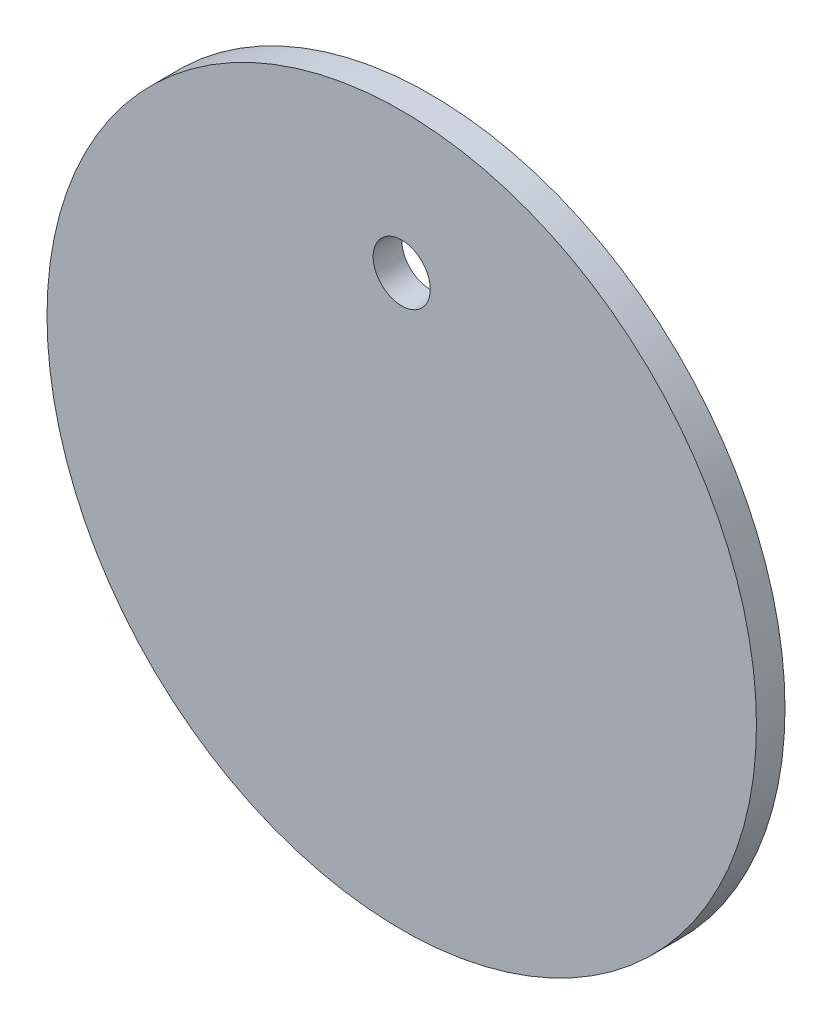
ISO-10303-21;
HEADER;
FILE_DESCRIPTION(('STEP AP214'),'2;1');
FILE_NAME('part.step','',(''),(''),'','','');
FILE_SCHEMA(('AUTOMOTIVE_DESIGN { 1 0 10303 214 1 1 1 1 }'));
ENDSEC;
DATA;
#1=APPLICATION_CONTEXT('core data for automotive mechanical design processes');
#2=APPLICATION_PROTOCOL_DEFINITION('international standard','automotive_design',2000,#1);
#3=PRODUCT_CONTEXT('',#1,'mechanical');
#4=PRODUCT('Part','Part','',(#3));
#5=PRODUCT_RELATED_PRODUCT_CATEGORY('part','',(#4));
#6=PRODUCT_DEFINITION_FORMATION('','',#4);
#7=PRODUCT_DEFINITION_CONTEXT('part definition',#1,'design');
#8=PRODUCT_DEFINITION('design','',#6,#7);
#9=PRODUCT_DEFINITION_SHAPE('','',#8);
#10=(LENGTH_UNIT() NAMED_UNIT(*) SI_UNIT(.MILLI.,.METRE.));
#11=(NAMED_UNIT(*) PLANE_ANGLE_UNIT() SI_UNIT($,.RADIAN.));
#12=(NAMED_UNIT(*) SI_UNIT($,.STERADIAN.) SOLID_ANGLE_UNIT());
#13=UNCERTAINTY_MEASURE_WITH_UNIT(LENGTH_MEASURE(1.E-05),#10,'distance_accuracy_value','');
#14=(GEOMETRIC_REPRESENTATION_CONTEXT(3) GLOBAL_UNCERTAINTY_ASSIGNED_CONTEXT((#13)) GLOBAL_UNIT_ASSIGNED_CONTEXT((#10,
#11,#12)) REPRESENTATION_CONTEXT('',''));
#15=CARTESIAN_POINT('',(0.,0.,0.));
#16=DIRECTION('',(0.,0.,1.));
#17=DIRECTION('',(1.,0.,0.));
#18=AXIS2_PLACEMENT_3D('',#15,#16,#17);
#19=CARTESIAN_POINT('',(0.,0.,2.));
#20=DIRECTION('',(0.,0.,-1.));
#21=DIRECTION('',(-1.,0.,0.));
#22=AXIS2_PLACEMENT_3D('',#19,#20,#21);
#23=CYLINDRICAL_SURFACE('',#22,24.85);
#24=CARTESIAN_POINT('',(0.,0.,2.));
#25=DIRECTION('',(0.,0.,1.));
#26=DIRECTION('',(1.,0.,0.));
#27=AXIS2_PLACEMENT_3D('',#24,#25,#26);
#28=CIRCLE('',#27,24.85);
#29=CARTESIAN_POINT('',(24.85,0.,2.));
#30=VERTEX_POINT('',#29);
#31=EDGE_CURVE('E10',#30,#30,#28,.T.);
#32=ORIENTED_EDGE('',*,*,#31,.F.);
#33=EDGE_LOOP('',(#32));
#34=FACE_BOUND('',#33,.T.);
#35=CARTESIAN_POINT('',(0.,0.,0.));
#36=DIRECTION('',(0.,0.,1.));
#37=DIRECTION('',(1.,0.,0.));
#38=AXIS2_PLACEMENT_3D('',#35,#36,#37);
#39=CIRCLE('',#38,24.85);
#40=CARTESIAN_POINT('',(24.85,0.,0.));
#41=VERTEX_POINT('',#40);
#42=EDGE_CURVE('E34',#41,#41,#39,.T.);
#43=ORIENTED_EDGE('',*,*,#42,.T.);
#44=EDGE_LOOP('',(#43));
#45=FACE_BOUND('',#44,.T.);
#46=ADVANCED_FACE('F31',(#34,#45),#23,.T.);
#47=CARTESIAN_POINT('',(0.,0.,2.));
#48=DIRECTION('',(0.,0.,1.));
#49=DIRECTION('',(1.,0.,0.));
#50=AXIS2_PLACEMENT_3D('',#47,#48,#49);
#51=PLANE('',#50);
#52=CARTESIAN_POINT('',(0.,15.,2.));
#53=DIRECTION('',(0.,0.,1.));
#54=DIRECTION('',(1.,0.,0.));
#55=AXIS2_PLACEMENT_3D('',#52,#53,#54);
#56=CIRCLE('',#55,2.);
#57=CARTESIAN_POINT('',(2.,15.,2.));
#58=VERTEX_POINT('',#57);
#59=EDGE_CURVE('E43',#58,#58,#56,.T.);
#60=ORIENTED_EDGE('',*,*,#59,.F.);
#61=EDGE_LOOP('',(#60));
#62=FACE_BOUND('',#61,.T.);
#63=ORIENTED_EDGE('',*,*,#31,.T.);
#64=EDGE_LOOP('',(#63));
#65=FACE_BOUND('',#64,.T.);
#66=ADVANCED_FACE('F58',(#62,#65),#51,.T.);
#67=CARTESIAN_POINT('',(0.,0.,0.));
#68=DIRECTION('',(0.,0.,1.));
#69=DIRECTION('',(1.,0.,0.));
#70=AXIS2_PLACEMENT_3D('',#67,#68,#69);
#71=PLANE('',#70);
#72=CARTESIAN_POINT('',(0.,15.,0.));
#73=DIRECTION('',(0.,0.,1.));
#74=DIRECTION('',(1.,0.,0.));
#75=AXIS2_PLACEMENT_3D('',#72,#73,#74);
#76=CIRCLE('',#75,2.);
#77=CARTESIAN_POINT('',(2.,15.,0.));
#78=VERTEX_POINT('',#77);
#79=EDGE_CURVE('E41',#78,#78,#76,.T.);
#80=ORIENTED_EDGE('',*,*,#79,.T.);
#81=EDGE_LOOP('',(#80));
#82=FACE_BOUND('',#81,.T.);
#83=ORIENTED_EDGE('',*,*,#42,.F.);
#84=EDGE_LOOP('',(#83));
#85=FACE_BOUND('',#84,.T.);
#86=ADVANCED_FACE('F49',(#82,#85),#71,.F.);
#87=CARTESIAN_POINT('',(0.,15.,0.));
#88=DIRECTION('',(0.,0.,1.));
#89=DIRECTION('',(1.,0.,0.));
#90=AXIS2_PLACEMENT_3D('',#87,#88,#89);
#91=CYLINDRICAL_SURFACE('',#90,2.);
#92=ORIENTED_EDGE('',*,*,#79,.F.);
#93=EDGE_LOOP('',(#92));
#94=FACE_BOUND('',#93,.T.);
#95=ORIENTED_EDGE('',*,*,#59,.T.);
#96=EDGE_LOOP('',(#95));
#97=FACE_BOUND('',#96,.T.);
#98=ADVANCED_FACE('F52',(#94,#97),#91,.F.);
#99=CLOSED_SHELL('',(#46,#66,#86,#98));
#100=MANIFOLD_SOLID_BREP('B2',#99);
#101=ADVANCED_BREP_SHAPE_REPRESENTATION('',(#18,#100),#14);
#102=SHAPE_DEFINITION_REPRESENTATION(#9,#101);
ENDSEC;
END-ISO-10303-21;
